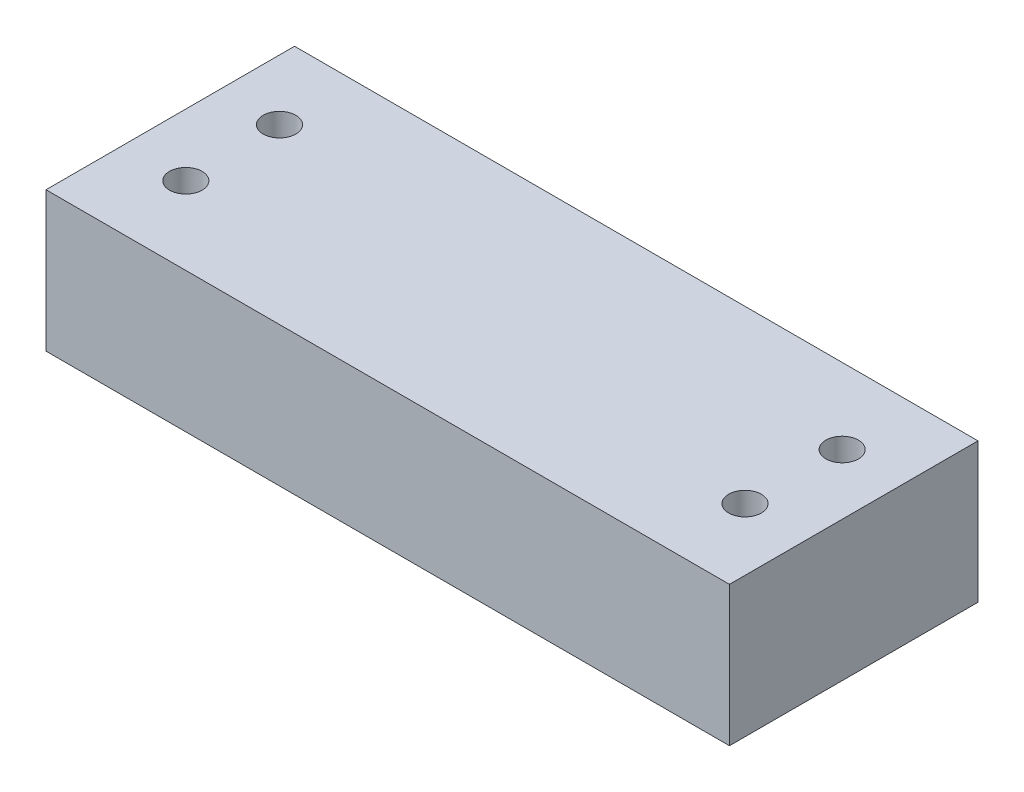
ISO-10303-21;
HEADER;
FILE_DESCRIPTION(('STEP AP214'),'2;1');
FILE_NAME('part.step','',(''),(''),'','','');
FILE_SCHEMA(('AUTOMOTIVE_DESIGN { 1 0 10303 214 1 1 1 1 }'));
ENDSEC;
DATA;
#1=APPLICATION_CONTEXT('core data for automotive mechanical design processes');
#2=APPLICATION_PROTOCOL_DEFINITION('international standard','automotive_design',2000,#1);
#3=PRODUCT_CONTEXT('',#1,'mechanical');
#4=PRODUCT('Part','Part','',(#3));
#5=PRODUCT_RELATED_PRODUCT_CATEGORY('part','',(#4));
#6=PRODUCT_DEFINITION_FORMATION('','',#4);
#7=PRODUCT_DEFINITION_CONTEXT('part definition',#1,'design');
#8=PRODUCT_DEFINITION('design','',#6,#7);
#9=PRODUCT_DEFINITION_SHAPE('','',#8);
#10=(LENGTH_UNIT() NAMED_UNIT(*) SI_UNIT(.MILLI.,.METRE.));
#11=(NAMED_UNIT(*) PLANE_ANGLE_UNIT() SI_UNIT($,.RADIAN.));
#12=(NAMED_UNIT(*) SI_UNIT($,.STERADIAN.) SOLID_ANGLE_UNIT());
#13=UNCERTAINTY_MEASURE_WITH_UNIT(LENGTH_MEASURE(1.E-05),#10,'distance_accuracy_value','');
#14=(GEOMETRIC_REPRESENTATION_CONTEXT(3) GLOBAL_UNCERTAINTY_ASSIGNED_CONTEXT((#13)) GLOBAL_UNIT_ASSIGNED_CONTEXT((#10,
#11,#12)) REPRESENTATION_CONTEXT('',''));
#15=CARTESIAN_POINT('',(0.,0.,0.));
#16=DIRECTION('',(0.,0.,1.));
#17=DIRECTION('',(1.,0.,0.));
#18=AXIS2_PLACEMENT_3D('',#15,#16,#17);
#19=CARTESIAN_POINT('',(-44.,18.,16.));
#20=DIRECTION('',(1.,0.,0.));
#21=DIRECTION('',(0.,0.,-1.));
#22=AXIS2_PLACEMENT_3D('',#19,#20,#21);
#23=PLANE('',#22);
#24=DIRECTION('',(0.,0.,1.));
#25=VECTOR('',#24,1.);
#26=CARTESIAN_POINT('',(-44.,0.,16.));
#27=LINE('',#26,#25);
#28=CARTESIAN_POINT('',(-44.,0.,-16.));
#29=VERTEX_POINT('',#28);
#30=CARTESIAN_POINT('',(-44.,0.,16.));
#31=VERTEX_POINT('',#30);
#32=EDGE_CURVE('E98',#29,#31,#27,.T.);
#33=ORIENTED_EDGE('',*,*,#32,.T.);
#34=DIRECTION('',(0.,-1.,0.));
#35=VECTOR('',#34,1.);
#36=CARTESIAN_POINT('',(-44.,18.,16.));
#37=LINE('',#36,#35);
#38=CARTESIAN_POINT('',(-44.,18.,16.));
#39=VERTEX_POINT('',#38);
#40=EDGE_CURVE('E11',#39,#31,#37,.T.);
#41=ORIENTED_EDGE('',*,*,#40,.F.);
#42=DIRECTION('',(0.,0.,1.));
#43=VECTOR('',#42,1.);
#44=CARTESIAN_POINT('',(-44.,18.,16.));
#45=LINE('',#44,#43);
#46=CARTESIAN_POINT('',(-44.,18.,-16.));
#47=VERTEX_POINT('',#46);
#48=EDGE_CURVE('E86',#47,#39,#45,.T.);
#49=ORIENTED_EDGE('',*,*,#48,.F.);
#50=DIRECTION('',(0.,-1.,0.));
#51=VECTOR('',#50,1.);
#52=CARTESIAN_POINT('',(-44.,18.,-16.));
#53=LINE('',#52,#51);
#54=EDGE_CURVE('E94',#47,#29,#53,.T.);
#55=ORIENTED_EDGE('',*,*,#54,.T.);
#56=EDGE_LOOP('',(#33,#41,#49,#55));
#57=FACE_BOUND('',#56,.T.);
#58=ADVANCED_FACE('F35',(#57),#23,.F.);
#59=CARTESIAN_POINT('',(44.,18.,16.));
#60=DIRECTION('',(0.,0.,-1.));
#61=DIRECTION('',(-1.,0.,0.));
#62=AXIS2_PLACEMENT_3D('',#59,#60,#61);
#63=PLANE('',#62);
#64=DIRECTION('',(1.,0.,0.));
#65=VECTOR('',#64,1.);
#66=CARTESIAN_POINT('',(44.,0.,16.));
#67=LINE('',#66,#65);
#68=CARTESIAN_POINT('',(44.,0.,16.));
#69=VERTEX_POINT('',#68);
#70=EDGE_CURVE('E90',#31,#69,#67,.T.);
#71=ORIENTED_EDGE('',*,*,#70,.T.);
#72=DIRECTION('',(0.,-1.,0.));
#73=VECTOR('',#72,1.);
#74=CARTESIAN_POINT('',(44.,18.,16.));
#75=LINE('',#74,#73);
#76=CARTESIAN_POINT('',(44.,18.,16.));
#77=VERTEX_POINT('',#76);
#78=EDGE_CURVE('E43',#77,#69,#75,.T.);
#79=ORIENTED_EDGE('',*,*,#78,.F.);
#80=DIRECTION('',(1.,0.,0.));
#81=VECTOR('',#80,1.);
#82=CARTESIAN_POINT('',(44.,18.,16.));
#83=LINE('',#82,#81);
#84=EDGE_CURVE('E81',#39,#77,#83,.T.);
#85=ORIENTED_EDGE('',*,*,#84,.F.);
#86=ORIENTED_EDGE('',*,*,#40,.T.);
#87=EDGE_LOOP('',(#71,#79,#85,#86));
#88=FACE_BOUND('',#87,.T.);
#89=ADVANCED_FACE('F89',(#88),#63,.F.);
#90=CARTESIAN_POINT('',(44.,18.,16.));
#91=DIRECTION('',(-1.,0.,0.));
#92=DIRECTION('',(0.,0.,1.));
#93=AXIS2_PLACEMENT_3D('',#90,#91,#92);
#94=PLANE('',#93);
#95=DIRECTION('',(0.,0.,-1.));
#96=VECTOR('',#95,1.);
#97=CARTESIAN_POINT('',(44.,0.,16.));
#98=LINE('',#97,#96);
#99=CARTESIAN_POINT('',(44.,0.,-16.));
#100=VERTEX_POINT('',#99);
#101=EDGE_CURVE('E68',#69,#100,#98,.T.);
#102=ORIENTED_EDGE('',*,*,#101,.T.);
#103=DIRECTION('',(0.,-1.,0.));
#104=VECTOR('',#103,1.);
#105=CARTESIAN_POINT('',(44.,18.,-16.));
#106=LINE('',#105,#104);
#107=CARTESIAN_POINT('',(44.,18.,-16.));
#108=VERTEX_POINT('',#107);
#109=EDGE_CURVE('E91',#108,#100,#106,.T.);
#110=ORIENTED_EDGE('',*,*,#109,.F.);
#111=DIRECTION('',(0.,0.,-1.));
#112=VECTOR('',#111,1.);
#113=CARTESIAN_POINT('',(44.,18.,16.));
#114=LINE('',#113,#112);
#115=EDGE_CURVE('E84',#77,#108,#114,.T.);
#116=ORIENTED_EDGE('',*,*,#115,.F.);
#117=ORIENTED_EDGE('',*,*,#78,.T.);
#118=EDGE_LOOP('',(#102,#110,#116,#117));
#119=FACE_BOUND('',#118,.T.);
#120=ADVANCED_FACE('F92',(#119),#94,.F.);
#121=CARTESIAN_POINT('',(44.,18.,-16.));
#122=DIRECTION('',(0.,0.,1.));
#123=DIRECTION('',(1.,0.,0.));
#124=AXIS2_PLACEMENT_3D('',#121,#122,#123);
#125=PLANE('',#124);
#126=DIRECTION('',(-1.,0.,0.));
#127=VECTOR('',#126,1.);
#128=CARTESIAN_POINT('',(44.,0.,-16.));
#129=LINE('',#128,#127);
#130=EDGE_CURVE('E74',#100,#29,#129,.T.);
#131=ORIENTED_EDGE('',*,*,#130,.T.);
#132=ORIENTED_EDGE('',*,*,#54,.F.);
#133=DIRECTION('',(-1.,0.,0.));
#134=VECTOR('',#133,1.);
#135=CARTESIAN_POINT('',(44.,18.,-16.));
#136=LINE('',#135,#134);
#137=EDGE_CURVE('E51',#108,#47,#136,.T.);
#138=ORIENTED_EDGE('',*,*,#137,.F.);
#139=ORIENTED_EDGE('',*,*,#109,.T.);
#140=EDGE_LOOP('',(#131,#132,#138,#139));
#141=FACE_BOUND('',#140,.T.);
#142=ADVANCED_FACE('F106',(#141),#125,.F.);
#143=CARTESIAN_POINT('',(0.,18.,0.));
#144=DIRECTION('',(0.,1.,0.));
#145=DIRECTION('',(0.,0.,1.));
#146=AXIS2_PLACEMENT_3D('',#143,#144,#145);
#147=PLANE('',#146);
#148=CARTESIAN_POINT('',(36.,18.,6.));
#149=DIRECTION('',(0.,1.,0.));
#150=DIRECTION('',(0.,0.,1.));
#151=AXIS2_PLACEMENT_3D('',#148,#149,#150);
#152=CIRCLE('',#151,2.09999999999999);
#153=CARTESIAN_POINT('',(36.,18.,8.09999999999999));
#154=VERTEX_POINT('',#153);
#155=EDGE_CURVE('E132',#154,#154,#152,.T.);
#156=ORIENTED_EDGE('',*,*,#155,.F.);
#157=EDGE_LOOP('',(#156));
#158=FACE_BOUND('',#157,.T.);
#159=CARTESIAN_POINT('',(36.2232266195804,18.,-6.28663628577293));
#160=DIRECTION('',(0.,1.,0.));
#161=DIRECTION('',(0.,0.,1.));
#162=AXIS2_PLACEMENT_3D('',#159,#160,#161);
#163=CIRCLE('',#162,2.09999999999999);
#164=CARTESIAN_POINT('',(36.2232266195804,18.,-4.18663628577294));
#165=VERTEX_POINT('',#164);
#166=EDGE_CURVE('E126',#165,#165,#163,.T.);
#167=ORIENTED_EDGE('',*,*,#166,.F.);
#168=EDGE_LOOP('',(#167));
#169=FACE_BOUND('',#168,.T.);
#170=CARTESIAN_POINT('',(-36.,18.,6.));
#171=DIRECTION('',(0.,1.,0.));
#172=DIRECTION('',(0.,0.,1.));
#173=AXIS2_PLACEMENT_3D('',#170,#171,#172);
#174=CIRCLE('',#173,2.09999999999999);
#175=CARTESIAN_POINT('',(-36.,18.,8.09999999999999));
#176=VERTEX_POINT('',#175);
#177=EDGE_CURVE('E120',#176,#176,#174,.T.);
#178=ORIENTED_EDGE('',*,*,#177,.F.);
#179=EDGE_LOOP('',(#178));
#180=FACE_BOUND('',#179,.T.);
#181=CARTESIAN_POINT('',(-36.2232266195803,18.,-6.28663628577293));
#182=DIRECTION('',(0.,1.,0.));
#183=DIRECTION('',(0.,0.,1.));
#184=AXIS2_PLACEMENT_3D('',#181,#182,#183);
#185=CIRCLE('',#184,2.09999999999999);
#186=CARTESIAN_POINT('',(-36.2232266195803,18.,-4.18663628577294));
#187=VERTEX_POINT('',#186);
#188=EDGE_CURVE('E114',#187,#187,#185,.T.);
#189=ORIENTED_EDGE('',*,*,#188,.F.);
#190=EDGE_LOOP('',(#189));
#191=FACE_BOUND('',#190,.T.);
#192=ORIENTED_EDGE('',*,*,#48,.T.);
#193=ORIENTED_EDGE('',*,*,#84,.T.);
#194=ORIENTED_EDGE('',*,*,#115,.T.);
#195=ORIENTED_EDGE('',*,*,#137,.T.);
#196=EDGE_LOOP('',(#192,#193,#194,#195));
#197=FACE_BOUND('',#196,.T.);
#198=ADVANCED_FACE('F82',(#158,#169,#180,#191,#197),#147,.T.);
#199=CARTESIAN_POINT('',(0.,0.,0.));
#200=DIRECTION('',(0.,1.,0.));
#201=DIRECTION('',(0.,0.,1.));
#202=AXIS2_PLACEMENT_3D('',#199,#200,#201);
#203=PLANE('',#202);
#204=CARTESIAN_POINT('',(36.,0.,6.));
#205=DIRECTION('',(0.,1.,0.));
#206=DIRECTION('',(0.,0.,1.));
#207=AXIS2_PLACEMENT_3D('',#204,#205,#206);
#208=CIRCLE('',#207,2.1);
#209=CARTESIAN_POINT('',(36.,0.,8.1));
#210=VERTEX_POINT('',#209);
#211=EDGE_CURVE('E129',#210,#210,#208,.T.);
#212=ORIENTED_EDGE('',*,*,#211,.T.);
#213=EDGE_LOOP('',(#212));
#214=FACE_BOUND('',#213,.T.);
#215=CARTESIAN_POINT('',(36.2232266195804,0.,-6.28663628577293));
#216=DIRECTION('',(0.,1.,0.));
#217=DIRECTION('',(0.,0.,1.));
#218=AXIS2_PLACEMENT_3D('',#215,#216,#217);
#219=CIRCLE('',#218,2.1);
#220=CARTESIAN_POINT('',(36.2232266195804,0.,-4.18663628577293));
#221=VERTEX_POINT('',#220);
#222=EDGE_CURVE('E123',#221,#221,#219,.T.);
#223=ORIENTED_EDGE('',*,*,#222,.T.);
#224=EDGE_LOOP('',(#223));
#225=FACE_BOUND('',#224,.T.);
#226=CARTESIAN_POINT('',(-36.,0.,6.));
#227=DIRECTION('',(0.,1.,0.));
#228=DIRECTION('',(0.,0.,1.));
#229=AXIS2_PLACEMENT_3D('',#226,#227,#228);
#230=CIRCLE('',#229,2.1);
#231=CARTESIAN_POINT('',(-36.,0.,8.1));
#232=VERTEX_POINT('',#231);
#233=EDGE_CURVE('E117',#232,#232,#230,.T.);
#234=ORIENTED_EDGE('',*,*,#233,.T.);
#235=EDGE_LOOP('',(#234));
#236=FACE_BOUND('',#235,.T.);
#237=CARTESIAN_POINT('',(-36.2232266195803,0.,-6.28663628577293));
#238=DIRECTION('',(0.,1.,0.));
#239=DIRECTION('',(0.,0.,1.));
#240=AXIS2_PLACEMENT_3D('',#237,#238,#239);
#241=CIRCLE('',#240,2.1);
#242=CARTESIAN_POINT('',(-36.2232266195803,0.,-4.18663628577293));
#243=VERTEX_POINT('',#242);
#244=EDGE_CURVE('E101',#243,#243,#241,.T.);
#245=ORIENTED_EDGE('',*,*,#244,.T.);
#246=EDGE_LOOP('',(#245));
#247=FACE_BOUND('',#246,.T.);
#248=ORIENTED_EDGE('',*,*,#32,.F.);
#249=ORIENTED_EDGE('',*,*,#130,.F.);
#250=ORIENTED_EDGE('',*,*,#101,.F.);
#251=ORIENTED_EDGE('',*,*,#70,.F.);
#252=EDGE_LOOP('',(#248,#249,#250,#251));
#253=FACE_BOUND('',#252,.T.);
#254=ADVANCED_FACE('F109',(#214,#225,#236,#247,#253),#203,.F.);
#255=CARTESIAN_POINT('',(-36.2232266195803,18.,-6.28663628577293));
#256=DIRECTION('',(0.,1.,0.));
#257=DIRECTION('',(0.,0.,1.));
#258=AXIS2_PLACEMENT_3D('',#255,#256,#257);
#259=CYLINDRICAL_SURFACE('',#258,2.09999999999999);
#260=ORIENTED_EDGE('',*,*,#244,.F.);
#261=EDGE_LOOP('',(#260));
#262=FACE_BOUND('',#261,.T.);
#263=ORIENTED_EDGE('',*,*,#188,.T.);
#264=EDGE_LOOP('',(#263));
#265=FACE_BOUND('',#264,.T.);
#266=ADVANCED_FACE('F147',(#262,#265),#259,.F.);
#267=CARTESIAN_POINT('',(-36.,18.,6.));
#268=DIRECTION('',(0.,1.,0.));
#269=DIRECTION('',(0.,0.,1.));
#270=AXIS2_PLACEMENT_3D('',#267,#268,#269);
#271=CYLINDRICAL_SURFACE('',#270,2.09999999999999);
#272=ORIENTED_EDGE('',*,*,#233,.F.);
#273=EDGE_LOOP('',(#272));
#274=FACE_BOUND('',#273,.T.);
#275=ORIENTED_EDGE('',*,*,#177,.T.);
#276=EDGE_LOOP('',(#275));
#277=FACE_BOUND('',#276,.T.);
#278=ADVANCED_FACE('F149',(#274,#277),#271,.F.);
#279=CARTESIAN_POINT('',(36.2232266195804,18.,-6.28663628577293));
#280=DIRECTION('',(0.,1.,0.));
#281=DIRECTION('',(0.,0.,1.));
#282=AXIS2_PLACEMENT_3D('',#279,#280,#281);
#283=CYLINDRICAL_SURFACE('',#282,2.09999999999999);
#284=ORIENTED_EDGE('',*,*,#222,.F.);
#285=EDGE_LOOP('',(#284));
#286=FACE_BOUND('',#285,.T.);
#287=ORIENTED_EDGE('',*,*,#166,.T.);
#288=EDGE_LOOP('',(#287));
#289=FACE_BOUND('',#288,.T.);
#290=ADVANCED_FACE('F156',(#286,#289),#283,.F.);
#291=CARTESIAN_POINT('',(36.,18.,6.));
#292=DIRECTION('',(0.,1.,0.));
#293=DIRECTION('',(0.,0.,1.));
#294=AXIS2_PLACEMENT_3D('',#291,#292,#293);
#295=CYLINDRICAL_SURFACE('',#294,2.09999999999999);
#296=ORIENTED_EDGE('',*,*,#211,.F.);
#297=EDGE_LOOP('',(#296));
#298=FACE_BOUND('',#297,.T.);
#299=ORIENTED_EDGE('',*,*,#155,.T.);
#300=EDGE_LOOP('',(#299));
#301=FACE_BOUND('',#300,.T.);
#302=ADVANCED_FACE('F136',(#298,#301),#295,.F.);
#303=CLOSED_SHELL('',(#58,#89,#120,#142,#198,#254,#266,#278,#290,#302));
#304=MANIFOLD_SOLID_BREP('B2',#303);
#305=ADVANCED_BREP_SHAPE_REPRESENTATION('',(#18,#304),#14);
#306=SHAPE_DEFINITION_REPRESENTATION(#9,#305);
ENDSEC;
END-ISO-10303-21;
